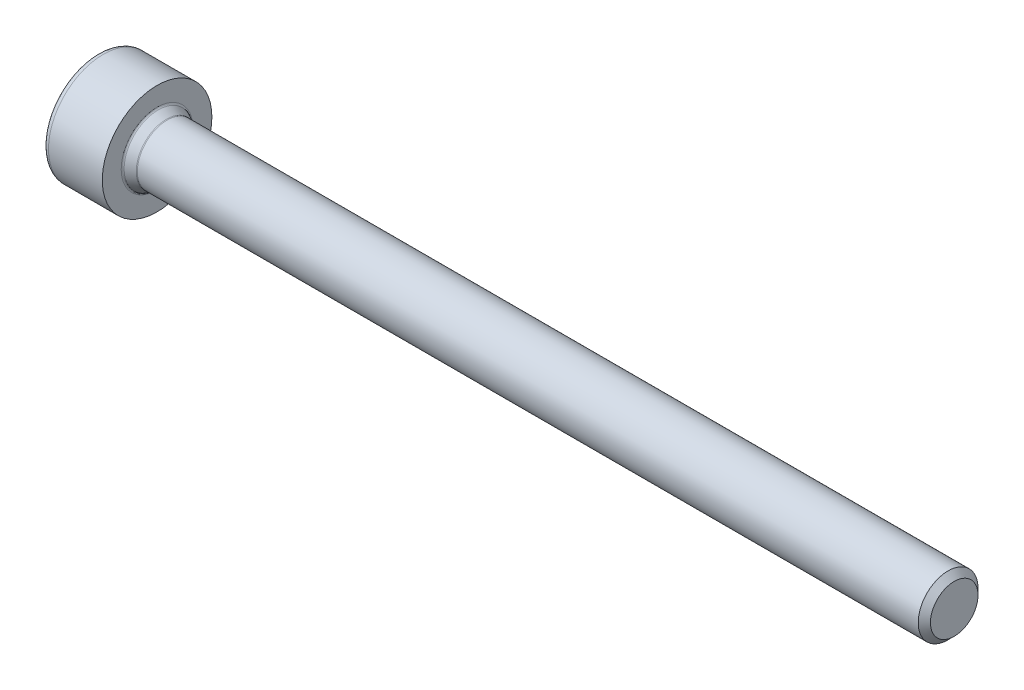
ISO-10303-21;
HEADER;
FILE_DESCRIPTION(('STEP AP214'),'2;1');
FILE_NAME('part.step','',(''),(''),'','','');
FILE_SCHEMA(('AUTOMOTIVE_DESIGN { 1 0 10303 214 1 1 1 1 }'));
ENDSEC;
DATA;
#1=APPLICATION_CONTEXT('core data for automotive mechanical design processes');
#2=APPLICATION_PROTOCOL_DEFINITION('international standard','automotive_design',2000,#1);
#3=PRODUCT_CONTEXT('',#1,'mechanical');
#4=PRODUCT('Part','Part','',(#3));
#5=PRODUCT_RELATED_PRODUCT_CATEGORY('part','',(#4));
#6=PRODUCT_DEFINITION_FORMATION('','',#4);
#7=PRODUCT_DEFINITION_CONTEXT('part definition',#1,'design');
#8=PRODUCT_DEFINITION('design','',#6,#7);
#9=PRODUCT_DEFINITION_SHAPE('','',#8);
#10=(LENGTH_UNIT() NAMED_UNIT(*) SI_UNIT(.MILLI.,.METRE.));
#11=(NAMED_UNIT(*) PLANE_ANGLE_UNIT() SI_UNIT($,.RADIAN.));
#12=(NAMED_UNIT(*) SI_UNIT($,.STERADIAN.) SOLID_ANGLE_UNIT());
#13=UNCERTAINTY_MEASURE_WITH_UNIT(LENGTH_MEASURE(1.E-05),#10,'distance_accuracy_value','');
#14=(GEOMETRIC_REPRESENTATION_CONTEXT(3) GLOBAL_UNCERTAINTY_ASSIGNED_CONTEXT((#13)) GLOBAL_UNIT_ASSIGNED_CONTEXT((#10,
#11,#12)) REPRESENTATION_CONTEXT('',''));
#15=CARTESIAN_POINT('',(0.,0.,0.));
#16=DIRECTION('',(0.,0.,1.));
#17=DIRECTION('',(1.,0.,0.));
#18=AXIS2_PLACEMENT_3D('',#15,#16,#17);
#19=CARTESIAN_POINT('',(-2.9075,0.,0.));
#20=DIRECTION('',(-1.,0.,0.));
#21=DIRECTION('',(0.,0.,-1.));
#22=AXIS2_PLACEMENT_3D('',#19,#20,#21);
#23=CONICAL_SURFACE('',#22,1.3425,0.7853981633973);
#24=CARTESIAN_POINT('',(-3.,0.,0.));
#25=DIRECTION('',(1.,0.,0.));
#26=DIRECTION('',(0.,0.491140907266199,0.871080139372799));
#27=AXIS2_PLACEMENT_3D('',#24,#25,#26);
#28=CIRCLE('',#27,1.435);
#29=CARTESIAN_POINT('',(-2.99999999999999,0.704787201926916,1.25));
#30=VERTEX_POINT('',#29);
#31=CARTESIAN_POINT('',(-2.99999999999984,-0.70478720192637,1.25000000000013));
#32=VERTEX_POINT('',#31);
#33=EDGE_CURVE('E159',#30,#32,#28,.T.);
#34=ORIENTED_EDGE('',*,*,#33,.F.);
#35=CARTESIAN_POINT('',(-2.99999999999969,-0.704787201926252,1.25));
#36=CARTESIAN_POINT('',(-2.97628521465341,-0.65646362036293,1.25));
#37=CARTESIAN_POINT('',(-2.95399453161448,-0.607346612474087,1.25));
#38=CARTESIAN_POINT('',(-2.91320818109187,-0.507229058889315,1.25));
#39=CARTESIAN_POINT('',(-2.89473623112673,-0.456218934072351,1.25));
#40=CARTESIAN_POINT('',(-2.86290698914588,-0.352798361186506,1.25));
#41=CARTESIAN_POINT('',(-2.84953056237021,-0.300393958639836,1.25));
#42=CARTESIAN_POINT('',(-2.82898027876658,-0.194487441720485,1.25));
#43=CARTESIAN_POINT('',(-2.82178823977539,-0.140989021874516,1.25));
#44=CARTESIAN_POINT('',(-2.81703078818954,-0.0727567227819167,1.25));
#45=CARTESIAN_POINT('',(-2.81627010168138,-0.0582126032376335,1.25));
#46=CARTESIAN_POINT('',(-2.81525458541861,-0.0291129972122368,1.25));
#47=CARTESIAN_POINT('',(-2.81499952620831,-0.0145575188872272,1.25));
#48=CARTESIAN_POINT('',(-2.81500123473012,0.0379377877025121,1.25));
#49=CARTESIAN_POINT('',(-2.81673793612621,0.075889433997383,1.25));
#50=CARTESIAN_POINT('',(-2.82358164401925,0.15149658655596,1.25));
#51=CARTESIAN_POINT('',(-2.82869102651631,0.189151865095155,1.25));
#52=CARTESIAN_POINT('',(-2.84875546782902,0.301599972661517,1.25));
#53=CARTESIAN_POINT('',(-2.86844359299294,0.375574474615403,1.25));
#54=CARTESIAN_POINT('',(-2.90770920230099,0.492061542974082,1.25));
#55=CARTESIAN_POINT('',(-2.92436216214609,0.535638893484887,1.25));
#56=CARTESIAN_POINT('',(-2.96033907941291,0.621244601118333,1.25));
#57=CARTESIAN_POINT('',(-2.97963888447641,0.663283043107509,1.25));
#58=CARTESIAN_POINT('',(-3.00000000000001,0.704787201926896,1.25));
#59=B_SPLINE_CURVE_WITH_KNOTS('',3,(#35,#36,#37,#38,#39,#40,#41,#42,#43,#44,#45,#46,#47,#48,#49,
#50,#51,#52,#53,#54,#55,#56,#57,#58),.UNSPECIFIED.,.F.,.F.,(4,2,2,2,2,2,2,2,2,2,2,4),(0.,
0.161592976396798,0.324161275577647,0.486112933084189,0.647586807011873,0.691272786931178,
0.734938937435903,0.848735605705226,0.962612527596107,1.19125625256394,1.33113310638875,
1.46980937836746),.UNSPECIFIED.);
#60=EDGE_CURVE('E41',#32,#30,#59,.T.);
#61=ORIENTED_EDGE('',*,*,#60,.F.);
#62=EDGE_LOOP('',(#34,#61));
#63=FACE_BOUND('',#62,.T.);
#64=ADVANCED_FACE('F17',(#63),#23,.F.);
#65=CARTESIAN_POINT('',(-3.,0.,-1.9425));
#66=DIRECTION('',(-1.,0.,0.));
#67=DIRECTION('',(0.,0.,-1.));
#68=AXIS2_PLACEMENT_3D('',#65,#66,#67);
#69=PLANE('',#68);
#70=CARTESIAN_POINT('',(-3.,0.,0.));
#71=DIRECTION('',(-1.,0.,0.));
#72=DIRECTION('',(0.,0.,1.));
#73=AXIS2_PLACEMENT_3D('',#70,#71,#72);
#74=CIRCLE('',#73,2.45);
#75=CARTESIAN_POINT('',(-3.,0.,2.45));
#76=VERTEX_POINT('',#75);
#77=EDGE_CURVE('E11',#76,#76,#74,.T.);
#78=ORIENTED_EDGE('',*,*,#77,.T.);
#79=EDGE_LOOP('',(#78));
#80=FACE_BOUND('',#79,.T.);
#81=DIRECTION('',(0.,-1.,1.480679727431E-11));
#82=VECTOR('',#81,1.);
#83=CARTESIAN_POINT('',(-3.,-0.7047872019261,-1.25));
#84=LINE('',#83,#82);
#85=CARTESIAN_POINT('',(-2.99999999999999,-0.704787201926908,-1.25));
#86=VERTEX_POINT('',#85);
#87=CARTESIAN_POINT('',(-3.,-0.721687836487,-1.25));
#88=VERTEX_POINT('',#87);
#89=EDGE_CURVE('E217',#86,#88,#84,.T.);
#90=ORIENTED_EDGE('',*,*,#89,.F.);
#91=CARTESIAN_POINT('',(-3.,0.,0.));
#92=DIRECTION('',(1.,0.,0.));
#93=DIRECTION('',(0.,-0.491140907266199,-0.871080139372799));
#94=AXIS2_PLACEMENT_3D('',#91,#92,#93);
#95=CIRCLE('',#94,1.435);
#96=CARTESIAN_POINT('',(-3.,0.704787201926685,-1.25000000000013));
#97=VERTEX_POINT('',#96);
#98=EDGE_CURVE('E32',#86,#97,#95,.T.);
#99=ORIENTED_EDGE('',*,*,#98,.T.);
#100=DIRECTION('',(0.,-1.,-1.495131792205E-11));
#101=VECTOR('',#100,1.);
#102=CARTESIAN_POINT('',(-3.,0.721687836487,-1.25));
#103=LINE('',#102,#101);
#104=CARTESIAN_POINT('',(-3.,0.721687836487,-1.25));
#105=VERTEX_POINT('',#104);
#106=EDGE_CURVE('E213',#105,#97,#103,.T.);
#107=ORIENTED_EDGE('',*,*,#106,.F.);
#108=DIRECTION('',(0.,-0.500000000012821,-0.866025403777036));
#109=VECTOR('',#108,1.);
#110=CARTESIAN_POINT('',(-3.,0.7301381537677,-1.23536362113));
#111=LINE('',#110,#109);
#112=CARTESIAN_POINT('',(-3.,0.730138153767155,-1.23536362113082));
#113=VERTEX_POINT('',#112);
#114=EDGE_CURVE('E229',#113,#105,#111,.T.);
#115=ORIENTED_EDGE('',*,*,#114,.F.);
#116=CARTESIAN_POINT('',(-3.,0.,0.));
#117=DIRECTION('',(1.,0.,0.));
#118=DIRECTION('',(0.,0.508807075795911,-0.860880572216619));
#119=AXIS2_PLACEMENT_3D('',#116,#117,#118);
#120=CIRCLE('',#119,1.435);
#121=CARTESIAN_POINT('',(-3.,1.434925355694,-0.0146363788693456));
#122=VERTEX_POINT('',#121);
#123=EDGE_CURVE('E222',#113,#122,#120,.T.);
#124=ORIENTED_EDGE('',*,*,#123,.T.);
#125=DIRECTION('',(0.,-0.499999999986976,-0.866025403791958));
#126=VECTOR('',#125,1.);
#127=CARTESIAN_POINT('',(-3.,1.443375672974,0.));
#128=LINE('',#127,#126);
#129=CARTESIAN_POINT('',(-3.,1.443375672974,0.));
#130=VERTEX_POINT('',#129);
#131=EDGE_CURVE('E223',#130,#122,#128,.T.);
#132=ORIENTED_EDGE('',*,*,#131,.F.);
#133=DIRECTION('',(0.,0.499999999987212,-0.866025403791822));
#134=VECTOR('',#133,1.);
#135=CARTESIAN_POINT('',(-3.,1.434925355694,0.01463637886995));
#136=LINE('',#135,#134);
#137=CARTESIAN_POINT('',(-3.,1.434925355694,0.0146363788694952));
#138=VERTEX_POINT('',#137);
#139=EDGE_CURVE('E135',#138,#130,#136,.T.);
#140=ORIENTED_EDGE('',*,*,#139,.F.);
#141=CARTESIAN_POINT('',(-3.,0.,0.));
#142=DIRECTION('',(1.,0.,0.));
#143=DIRECTION('',(0.,0.999947983062032,0.0101995671561803));
#144=AXIS2_PLACEMENT_3D('',#141,#142,#143);
#145=CIRCLE('',#144,1.435);
#146=CARTESIAN_POINT('',(-3.,0.730138153767218,1.23536362113078));
#147=VERTEX_POINT('',#146);
#148=EDGE_CURVE('E228',#138,#147,#145,.T.);
#149=ORIENTED_EDGE('',*,*,#148,.T.);
#150=DIRECTION('',(0.,0.500000000012971,-0.86602540377695));
#151=VECTOR('',#150,1.);
#152=CARTESIAN_POINT('',(-3.,0.721687836487,1.25));
#153=LINE('',#152,#151);
#154=CARTESIAN_POINT('',(-3.,0.721687836487,1.25));
#155=VERTEX_POINT('',#154);
#156=EDGE_CURVE('E233',#155,#147,#153,.T.);
#157=ORIENTED_EDGE('',*,*,#156,.F.);
#158=DIRECTION('',(0.,1.,-1.480679727431E-11));
#159=VECTOR('',#158,1.);
#160=CARTESIAN_POINT('',(-3.,0.7047872019261,1.25));
#161=LINE('',#160,#159);
#162=EDGE_CURVE('E141',#30,#155,#161,.T.);
#163=ORIENTED_EDGE('',*,*,#162,.F.);
#164=ORIENTED_EDGE('',*,*,#33,.T.);
#165=DIRECTION('',(0.,1.,1.497759440346E-11));
#166=VECTOR('',#165,1.);
#167=CARTESIAN_POINT('',(-3.,-0.721687836487,1.25));
#168=LINE('',#167,#166);
#169=CARTESIAN_POINT('',(-3.,-0.721687836487,1.25));
#170=VERTEX_POINT('',#169);
#171=EDGE_CURVE('E156',#170,#32,#168,.T.);
#172=ORIENTED_EDGE('',*,*,#171,.F.);
#173=DIRECTION('',(0.,0.500000000012778,0.866025403777062));
#174=VECTOR('',#173,1.);
#175=CARTESIAN_POINT('',(-3.,-0.7301381537677,1.23536362113));
#176=LINE('',#175,#174);
#177=CARTESIAN_POINT('',(-3.,-0.730138153767155,1.23536362113082));
#178=VERTEX_POINT('',#177);
#179=EDGE_CURVE('E146',#178,#170,#176,.T.);
#180=ORIENTED_EDGE('',*,*,#179,.F.);
#181=CARTESIAN_POINT('',(-3.,0.,0.));
#182=DIRECTION('',(1.,0.,0.));
#183=DIRECTION('',(0.,-0.508807075795911,0.860880572216619));
#184=AXIS2_PLACEMENT_3D('',#181,#182,#183);
#185=CIRCLE('',#184,1.435);
#186=CARTESIAN_POINT('',(-3.,-1.434925355694,0.0146363788693456));
#187=VERTEX_POINT('',#186);
#188=EDGE_CURVE('E208',#178,#187,#185,.T.);
#189=ORIENTED_EDGE('',*,*,#188,.T.);
#190=DIRECTION('',(0.,0.499999999986976,0.866025403791958));
#191=VECTOR('',#190,1.);
#192=CARTESIAN_POINT('',(-3.,-1.443375672974,0.));
#193=LINE('',#192,#191);
#194=CARTESIAN_POINT('',(-3.,-1.443375672974,0.));
#195=VERTEX_POINT('',#194);
#196=EDGE_CURVE('E54',#195,#187,#193,.T.);
#197=ORIENTED_EDGE('',*,*,#196,.F.);
#198=DIRECTION('',(0.,-0.499999999987212,0.866025403791822));
#199=VECTOR('',#198,1.);
#200=CARTESIAN_POINT('',(-3.,-1.434925355694,-0.01463637886995));
#201=LINE('',#200,#199);
#202=CARTESIAN_POINT('',(-3.,-1.434925355694,-0.0146363788694952));
#203=VERTEX_POINT('',#202);
#204=EDGE_CURVE('E210',#203,#195,#201,.T.);
#205=ORIENTED_EDGE('',*,*,#204,.F.);
#206=CARTESIAN_POINT('',(-3.,0.,0.));
#207=DIRECTION('',(1.,0.,0.));
#208=DIRECTION('',(0.,-0.999947983062032,-0.0101995671561803));
#209=AXIS2_PLACEMENT_3D('',#206,#207,#208);
#210=CIRCLE('',#209,1.435);
#211=CARTESIAN_POINT('',(-3.,-0.730138153767219,-1.23536362113078));
#212=VERTEX_POINT('',#211);
#213=EDGE_CURVE('E205',#203,#212,#210,.T.);
#214=ORIENTED_EDGE('',*,*,#213,.T.);
#215=DIRECTION('',(0.,-0.500000000013014,0.866025403776925));
#216=VECTOR('',#215,1.);
#217=CARTESIAN_POINT('',(-3.,-0.721687836487,-1.25));
#218=LINE('',#217,#216);
#219=EDGE_CURVE('E201',#88,#212,#218,.T.);
#220=ORIENTED_EDGE('',*,*,#219,.F.);
#221=EDGE_LOOP('',(#90,#99,#107,#115,#124,#132,#140,#149,#157,#163,#164,#172,#180,#189,#197,
#205,#214,#220));
#222=FACE_BOUND('',#221,.T.);
#223=ADVANCED_FACE('F158',(#80,#222),#69,.T.);
#224=CARTESIAN_POINT('',(-2.7,0.,0.));
#225=DIRECTION('',(-1.,0.,0.));
#226=DIRECTION('',(0.,0.,1.));
#227=AXIS2_PLACEMENT_3D('',#224,#225,#226);
#228=TOROIDAL_SURFACE('',#227,2.45,0.3);
#229=CARTESIAN_POINT('',(-2.7,0.,0.));
#230=DIRECTION('',(-1.,0.,0.));
#231=DIRECTION('',(0.,0.,-1.));
#232=AXIS2_PLACEMENT_3D('',#229,#230,#231);
#233=CIRCLE('',#232,2.75);
#234=CARTESIAN_POINT('',(-2.7,0.,-2.75));
#235=VERTEX_POINT('',#234);
#236=EDGE_CURVE('E209',#235,#235,#233,.T.);
#237=ORIENTED_EDGE('',*,*,#236,.T.);
#238=EDGE_LOOP('',(#237));
#239=FACE_BOUND('',#238,.T.);
#240=ORIENTED_EDGE('',*,*,#77,.F.);
#241=EDGE_LOOP('',(#240));
#242=FACE_BOUND('',#241,.T.);
#243=ADVANCED_FACE('F337',(#239,#242),#228,.T.);
#244=CARTESIAN_POINT('',(-1.35,0.,0.));
#245=DIRECTION('',(1.,0.,0.));
#246=DIRECTION('',(0.,0.,-1.));
#247=AXIS2_PLACEMENT_3D('',#244,#245,#246);
#248=CYLINDRICAL_SURFACE('',#247,2.75);
#249=CARTESIAN_POINT('',(0.,0.,0.));
#250=DIRECTION('',(1.,0.,0.));
#251=DIRECTION('',(0.,0.,-1.));
#252=AXIS2_PLACEMENT_3D('',#249,#250,#251);
#253=CIRCLE('',#252,2.75);
#254=CARTESIAN_POINT('',(0.,0.,-2.75));
#255=VERTEX_POINT('',#254);
#256=EDGE_CURVE('E623',#255,#255,#253,.T.);
#257=ORIENTED_EDGE('',*,*,#256,.F.);
#258=EDGE_LOOP('',(#257));
#259=FACE_BOUND('',#258,.T.);
#260=ORIENTED_EDGE('',*,*,#236,.F.);
#261=EDGE_LOOP('',(#260));
#262=FACE_BOUND('',#261,.T.);
#263=ADVANCED_FACE('F344',(#259,#262),#248,.T.);
#264=CARTESIAN_POINT('',(0.,0.,-2.275));
#265=DIRECTION('',(1.,0.,0.));
#266=DIRECTION('',(0.,0.,1.));
#267=AXIS2_PLACEMENT_3D('',#264,#265,#266);
#268=PLANE('',#267);
#269=ORIENTED_EDGE('',*,*,#256,.T.);
#270=EDGE_LOOP('',(#269));
#271=FACE_BOUND('',#270,.T.);
#272=CARTESIAN_POINT('',(0.,0.,0.));
#273=DIRECTION('',(-1.,0.,0.));
#274=DIRECTION('',(0.,0.,1.));
#275=AXIS2_PLACEMENT_3D('',#272,#273,#274);
#276=CIRCLE('',#275,1.8);
#277=CARTESIAN_POINT('',(0.,0.,1.8));
#278=VERTEX_POINT('',#277);
#279=EDGE_CURVE('E620',#278,#278,#276,.T.);
#280=ORIENTED_EDGE('',*,*,#279,.T.);
#281=EDGE_LOOP('',(#280));
#282=FACE_BOUND('',#281,.T.);
#283=ADVANCED_FACE('F348',(#271,#282),#268,.T.);
#284=CARTESIAN_POINT('',(0.1,0.,0.));
#285=DIRECTION('',(-1.,0.,0.));
#286=DIRECTION('',(0.,0.,1.));
#287=AXIS2_PLACEMENT_3D('',#284,#285,#286);
#288=TOROIDAL_SURFACE('',#287,1.8,0.1);
#289=CARTESIAN_POINT('',(0.05615763679786,0.,0.));
#290=DIRECTION('',(-1.,0.,0.));
#291=DIRECTION('',(0.,0.,-1.));
#292=AXIS2_PLACEMENT_3D('',#289,#290,#291);
#293=CIRCLE('',#292,1.710123155436);
#294=CARTESIAN_POINT('',(0.05615763679786,0.,-1.710123155436));
#295=VERTEX_POINT('',#294);
#296=EDGE_CURVE('E615',#295,#295,#293,.T.);
#297=ORIENTED_EDGE('',*,*,#296,.T.);
#298=EDGE_LOOP('',(#297));
#299=FACE_BOUND('',#298,.T.);
#300=ORIENTED_EDGE('',*,*,#279,.F.);
#301=EDGE_LOOP('',(#300));
#302=FACE_BOUND('',#301,.T.);
#303=ADVANCED_FACE('F352',(#299,#302),#288,.F.);
#304=CARTESIAN_POINT('',(0.2611576367979,0.,0.));
#305=DIRECTION('',(-1.,0.,0.));
#306=DIRECTION('',(0.,0.,-1.));
#307=AXIS2_PLACEMENT_3D('',#304,#305,#306);
#308=CONICAL_SURFACE('',#307,1.610123155436,0.453844001521399);
#309=CARTESIAN_POINT('',(0.4661576367979,0.,0.));
#310=DIRECTION('',(1.,0.,0.));
#311=DIRECTION('',(0.,0.,-1.));
#312=AXIS2_PLACEMENT_3D('',#309,#310,#311);
#313=CIRCLE('',#312,1.510123155436);
#314=CARTESIAN_POINT('',(0.4661576367979,0.,-1.510123155436));
#315=VERTEX_POINT('',#314);
#316=EDGE_CURVE('E385',#315,#315,#313,.T.);
#317=ORIENTED_EDGE('',*,*,#316,.F.);
#318=EDGE_LOOP('',(#317));
#319=FACE_BOUND('',#318,.T.);
#320=ORIENTED_EDGE('',*,*,#296,.F.);
#321=EDGE_LOOP('',(#320));
#322=FACE_BOUND('',#321,.T.);
#323=ADVANCED_FACE('F356',(#319,#322),#308,.T.);
#324=CARTESIAN_POINT('',(0.51,0.,0.));
#325=DIRECTION('',(-1.,0.,0.));
#326=DIRECTION('',(0.,0.,1.));
#327=AXIS2_PLACEMENT_3D('',#324,#325,#326);
#328=TOROIDAL_SURFACE('',#327,1.6,0.1);
#329=CARTESIAN_POINT('',(0.51,0.,0.));
#330=DIRECTION('',(-1.,0.,0.));
#331=DIRECTION('',(0.,0.,-1.));
#332=AXIS2_PLACEMENT_3D('',#329,#330,#331);
#333=CIRCLE('',#332,1.5);
#334=CARTESIAN_POINT('',(0.51,0.,-1.5));
#335=VERTEX_POINT('',#334);
#336=EDGE_CURVE('E612',#335,#335,#333,.T.);
#337=ORIENTED_EDGE('',*,*,#336,.T.);
#338=EDGE_LOOP('',(#337));
#339=FACE_BOUND('',#338,.T.);
#340=ORIENTED_EDGE('',*,*,#316,.T.);
#341=EDGE_LOOP('',(#340));
#342=FACE_BOUND('',#341,.T.);
#343=ADVANCED_FACE('F360',(#339,#342),#328,.F.);
#344=CARTESIAN_POINT('',(20.10175,0.,0.));
#345=DIRECTION('',(1.,0.,0.));
#346=DIRECTION('',(0.,0.,-1.));
#347=AXIS2_PLACEMENT_3D('',#344,#345,#346);
#348=CYLINDRICAL_SURFACE('',#347,1.5);
#349=CARTESIAN_POINT('',(39.6935,0.,0.));
#350=DIRECTION('',(1.,0.,0.));
#351=DIRECTION('',(0.,0.,-1.));
#352=AXIS2_PLACEMENT_3D('',#349,#350,#351);
#353=CIRCLE('',#352,1.5);
#354=CARTESIAN_POINT('',(39.6935,0.,-1.5));
#355=VERTEX_POINT('',#354);
#356=EDGE_CURVE('E382',#355,#355,#353,.T.);
#357=ORIENTED_EDGE('',*,*,#356,.F.);
#358=EDGE_LOOP('',(#357));
#359=FACE_BOUND('',#358,.T.);
#360=ORIENTED_EDGE('',*,*,#336,.F.);
#361=EDGE_LOOP('',(#360));
#362=FACE_BOUND('',#361,.T.);
#363=ADVANCED_FACE('F364',(#359,#362),#348,.T.);
#364=CARTESIAN_POINT('',(39.84675,0.,0.));
#365=DIRECTION('',(-1.,0.,0.));
#366=DIRECTION('',(0.,0.,-1.));
#367=AXIS2_PLACEMENT_3D('',#364,#365,#366);
#368=CONICAL_SURFACE('',#367,1.34675,0.7853981633973);
#369=CARTESIAN_POINT('',(40.,0.,0.));
#370=DIRECTION('',(1.,0.,0.));
#371=DIRECTION('',(0.,0.,1.));
#372=AXIS2_PLACEMENT_3D('',#369,#370,#371);
#373=CIRCLE('',#372,1.1935);
#374=CARTESIAN_POINT('',(40.,0.,1.1935));
#375=VERTEX_POINT('',#374);
#376=EDGE_CURVE('E381',#375,#375,#373,.T.);
#377=ORIENTED_EDGE('',*,*,#376,.F.);
#378=EDGE_LOOP('',(#377));
#379=FACE_BOUND('',#378,.T.);
#380=ORIENTED_EDGE('',*,*,#356,.T.);
#381=EDGE_LOOP('',(#380));
#382=FACE_BOUND('',#381,.T.);
#383=ADVANCED_FACE('F368',(#379,#382),#368,.T.);
#384=CARTESIAN_POINT('',(40.,0.,-0.59675));
#385=DIRECTION('',(1.,0.,0.));
#386=DIRECTION('',(0.,0.,1.));
#387=AXIS2_PLACEMENT_3D('',#384,#385,#386);
#388=PLANE('',#387);
#389=ORIENTED_EDGE('',*,*,#376,.T.);
#390=EDGE_LOOP('',(#389));
#391=FACE_BOUND('',#390,.T.);
#392=ADVANCED_FACE('F371',(#391),#388,.T.);
#393=CARTESIAN_POINT('',(-1.15,-1.443375672974,0.));
#394=DIRECTION('',(0.,-0.866025403784429,-0.500000000000017));
#395=DIRECTION('',(0.,-0.500000000000017,0.866025403784429));
#396=AXIS2_PLACEMENT_3D('',#393,#394,#395);
#397=PLANE('',#396);
#398=DIRECTION('',(1.,0.,0.));
#399=VECTOR('',#398,1.);
#400=CARTESIAN_POINT('',(-3.,-1.443375672974,0.));
#401=LINE('',#400,#399);
#402=CARTESIAN_POINT('',(-1.15,-1.443375672974,0.));
#403=VERTEX_POINT('',#402);
#404=EDGE_CURVE('E203',#195,#403,#401,.T.);
#405=ORIENTED_EDGE('',*,*,#404,.T.);
#406=DIRECTION('',(0.,-0.500000000000017,0.866025403784429));
#407=VECTOR('',#406,1.);
#408=CARTESIAN_POINT('',(-1.15,-1.082531754731,-0.625));
#409=LINE('',#408,#407);
#410=CARTESIAN_POINT('',(-1.15,-1.082531754731,-0.625));
#411=VERTEX_POINT('',#410);
#412=EDGE_CURVE('E154',#411,#403,#409,.T.);
#413=ORIENTED_EDGE('',*,*,#412,.F.);
#414=DIRECTION('',(0.,-0.500000000000017,0.866025403784429));
#415=VECTOR('',#414,1.);
#416=CARTESIAN_POINT('',(-1.15,-0.721687836487,-1.25));
#417=LINE('',#416,#415);
#418=CARTESIAN_POINT('',(-1.15,-0.721687836487,-1.25));
#419=VERTEX_POINT('',#418);
#420=EDGE_CURVE('E183',#419,#411,#417,.T.);
#421=ORIENTED_EDGE('',*,*,#420,.F.);
#422=DIRECTION('',(1.,0.,0.));
#423=VECTOR('',#422,1.);
#424=CARTESIAN_POINT('',(-3.,-0.721687836487,-1.25));
#425=LINE('',#424,#423);
#426=EDGE_CURVE('E212',#88,#419,#425,.T.);
#427=ORIENTED_EDGE('',*,*,#426,.F.);
#428=ORIENTED_EDGE('',*,*,#219,.T.);
#429=CARTESIAN_POINT('',(-3.,-0.730138153766961,-1.23536362113092));
#430=CARTESIAN_POINT('',(-2.97628521465368,-0.754299944548643,-1.1935141718952));
#431=CARTESIAN_POINT('',(-2.95399453161471,-0.778858448493087,-1.15097759530554));
#432=CARTESIAN_POINT('',(-2.91320818109203,-0.82891722528552,-1.0642732505363));
#433=CARTESIAN_POINT('',(-2.89473623112685,-0.854422287694026,-1.02009718659456));
#434=CARTESIAN_POINT('',(-2.86290698914593,-0.906132574136999,-0.930532343201392));
#435=CARTESIAN_POINT('',(-2.84953056237022,-0.932334775410361,-0.885148799325785));
#436=CARTESIAN_POINT('',(-2.82898027876655,-0.985288033870092,-0.793431065247209));
#437=CARTESIAN_POINT('',(-2.82178823977534,-1.0120372437931,-0.747100074598227));
#438=CARTESIAN_POINT('',(-2.81703078818948,-1.04615339333947,-0.68800917022531));
#439=CARTESIAN_POINT('',(-2.81627010168131,-1.05342545311164,-0.675413593224224));
#440=CARTESIAN_POINT('',(-2.81525458541854,-1.06797525612441,-0.650212595165992));
#441=CARTESIAN_POINT('',(-2.81499952620824,-1.07525299528695,-0.63760718117224));
#442=CARTESIAN_POINT('',(-2.81500123473006,-1.10150064858186,-0.59214491208601));
#443=CARTESIAN_POINT('',(-2.81673793612616,-1.1204764717293,-0.559277822279208));
#444=CARTESIAN_POINT('',(-2.82358164401921,-1.15828004800859,-0.49380010745567));
#445=CARTESIAN_POINT('',(-2.82869102651628,-1.17710768727819,-0.461189679654146));
#446=CARTESIAN_POINT('',(-2.84875546782901,-1.23333174106138,-0.363806761894187));
#447=CARTESIAN_POINT('',(-2.86844359299295,-1.27031899203832,-0.299742963969819));
#448=CARTESIAN_POINT('',(-2.90770920230102,-1.32856252621765,-0.198862203558859));
#449=CARTESIAN_POINT('',(-2.92436216214611,-1.35035120147303,-0.161123110986915));
#450=CARTESIAN_POINT('',(-2.96033907941291,-1.39315405528972,-0.0869863934674693));
#451=CARTESIAN_POINT('',(-2.9796388844764,-1.41417327628429,-0.0505800347693544));
#452=CARTESIAN_POINT('',(-2.99999999999998,-1.43492535569397,-0.0146363788690904));
#453=B_SPLINE_CURVE_WITH_KNOTS('',3,(#429,#430,#431,#432,#433,#434,#435,#436,#437,#438,#439,
#440,#441,#442,#443,#444,#445,#446,#447,#448,#449,#450,#451,#452),.UNSPECIFIED.,.F.,.F.,(4,2,2,
2,2,2,2,2,2,2,2,4),(0.,0.161592976396964,0.324161275577982,0.486112933084696,0.64758680701255,
0.691272786932063,0.734938937436996,0.84873560570633,0.962612527597222,1.19125625256508,
1.33113310638978,1.46980937836838),.UNSPECIFIED.);
#454=EDGE_CURVE('E204',#212,#203,#453,.T.);
#455=ORIENTED_EDGE('',*,*,#454,.T.);
#456=ORIENTED_EDGE('',*,*,#204,.T.);
#457=EDGE_LOOP('',(#405,#413,#421,#427,#428,#455,#456));
#458=FACE_BOUND('',#457,.T.);
#459=ADVANCED_FACE('F253',(#458),#397,.F.);
#460=CARTESIAN_POINT('',(-2.9075,0.,0.));
#461=DIRECTION('',(-1.,0.,0.));
#462=DIRECTION('',(0.,0.,-1.));
#463=AXIS2_PLACEMENT_3D('',#460,#461,#462);
#464=CONICAL_SURFACE('',#463,1.3425,0.7853981633973);
#465=ORIENTED_EDGE('',*,*,#213,.F.);
#466=ORIENTED_EDGE('',*,*,#454,.F.);
#467=EDGE_LOOP('',(#465,#466));
#468=FACE_BOUND('',#467,.T.);
#469=ADVANCED_FACE('F256',(#468),#464,.F.);
#470=CARTESIAN_POINT('',(-1.15,-0.721687836487,-1.25));
#471=DIRECTION('',(0.,0.,-1.));
#472=DIRECTION('',(0.,-1.,0.));
#473=AXIS2_PLACEMENT_3D('',#470,#471,#472);
#474=PLANE('',#473);
#475=ORIENTED_EDGE('',*,*,#426,.T.);
#476=DIRECTION('',(0.,-1.,0.));
#477=VECTOR('',#476,1.);
#478=CARTESIAN_POINT('',(-1.15,0.,-1.25));
#479=LINE('',#478,#477);
#480=CARTESIAN_POINT('',(-1.15,0.,-1.25));
#481=VERTEX_POINT('',#480);
#482=EDGE_CURVE('E187',#481,#419,#479,.T.);
#483=ORIENTED_EDGE('',*,*,#482,.F.);
#484=DIRECTION('',(0.,-1.,0.));
#485=VECTOR('',#484,1.);
#486=CARTESIAN_POINT('',(-1.15,0.721687836487,-1.25));
#487=LINE('',#486,#485);
#488=CARTESIAN_POINT('',(-1.15,0.721687836487,-1.25));
#489=VERTEX_POINT('',#488);
#490=EDGE_CURVE('E199',#489,#481,#487,.T.);
#491=ORIENTED_EDGE('',*,*,#490,.F.);
#492=DIRECTION('',(1.,0.,0.));
#493=VECTOR('',#492,1.);
#494=CARTESIAN_POINT('',(-3.,0.721687836487,-1.25));
#495=LINE('',#494,#493);
#496=EDGE_CURVE('E220',#105,#489,#495,.T.);
#497=ORIENTED_EDGE('',*,*,#496,.F.);
#498=ORIENTED_EDGE('',*,*,#106,.T.);
#499=CARTESIAN_POINT('',(-2.99999999999969,0.704787201926252,-1.25));
#500=CARTESIAN_POINT('',(-2.97628521465341,0.65646362036293,-1.25));
#501=CARTESIAN_POINT('',(-2.95399453161448,0.607346612474086,-1.25));
#502=CARTESIAN_POINT('',(-2.91320818109187,0.507229058889314,-1.25));
#503=CARTESIAN_POINT('',(-2.89473623112673,0.45621893407235,-1.25));
#504=CARTESIAN_POINT('',(-2.86290698914588,0.352798361186506,-1.25));
#505=CARTESIAN_POINT('',(-2.8495305623702,0.300393958639835,-1.25));
#506=CARTESIAN_POINT('',(-2.82898027876658,0.194487441720485,-1.25));
#507=CARTESIAN_POINT('',(-2.82178823977539,0.140989021874516,-1.25));
#508=CARTESIAN_POINT('',(-2.81703078818954,0.0727567227819167,-1.25));
#509=CARTESIAN_POINT('',(-2.81627010168138,0.0582126032376335,-1.25));
#510=CARTESIAN_POINT('',(-2.81525458541861,0.0291129972122368,-1.25));
#511=CARTESIAN_POINT('',(-2.81499952620831,0.0145575188872272,-1.25));
#512=CARTESIAN_POINT('',(-2.81500123473012,-0.0379377877025123,-1.25));
#513=CARTESIAN_POINT('',(-2.81673793612621,-0.0758894339973834,-1.25));
#514=CARTESIAN_POINT('',(-2.82358164401925,-0.15149658655596,-1.25));
#515=CARTESIAN_POINT('',(-2.82869102651631,-0.189151865095156,-1.25));
#516=CARTESIAN_POINT('',(-2.84875546782902,-0.301599972661518,-1.25));
#517=CARTESIAN_POINT('',(-2.86844359299294,-0.375574474615403,-1.25));
#518=CARTESIAN_POINT('',(-2.90770920230095,-0.492061542973967,-1.25));
#519=CARTESIAN_POINT('',(-2.924362162146,-0.535638893484661,-1.25));
#520=CARTESIAN_POINT('',(-2.96033907941272,-0.621244601117893,-1.25));
#521=CARTESIAN_POINT('',(-2.97963888447616,-0.663283043106966,-1.25));
#522=CARTESIAN_POINT('',(-2.99999999999969,-0.704787201926252,-1.25));
#523=B_SPLINE_CURVE_WITH_KNOTS('',3,(#499,#500,#501,#502,#503,#504,#505,#506,#507,#508,#509,
#510,#511,#512,#513,#514,#515,#516,#517,#518,#519,#520,#521,#522),.UNSPECIFIED.,.F.,.F.,(4,2,2,
2,2,2,2,2,2,2,2,4),(0.,0.161592976396799,0.324161275577648,0.48611293308419,0.647586807011873,
0.691272786931178,0.734938937435903,0.848735605705227,0.962612527596108,1.19125625256394,
1.33113310638839,1.46980937836674),.UNSPECIFIED.);
#524=EDGE_CURVE('E216',#97,#86,#523,.T.);
#525=ORIENTED_EDGE('',*,*,#524,.T.);
#526=ORIENTED_EDGE('',*,*,#89,.T.);
#527=EDGE_LOOP('',(#475,#483,#491,#497,#498,#525,#526));
#528=FACE_BOUND('',#527,.T.);
#529=ADVANCED_FACE('F259',(#528),#474,.F.);
#530=CARTESIAN_POINT('',(-2.9075,0.,0.));
#531=DIRECTION('',(-1.,0.,0.));
#532=DIRECTION('',(0.,0.,-1.));
#533=AXIS2_PLACEMENT_3D('',#530,#531,#532);
#534=CONICAL_SURFACE('',#533,1.3425,0.7853981633973);
#535=ORIENTED_EDGE('',*,*,#98,.F.);
#536=ORIENTED_EDGE('',*,*,#524,.F.);
#537=EDGE_LOOP('',(#535,#536));
#538=FACE_BOUND('',#537,.T.);
#539=ADVANCED_FACE('F263',(#538),#534,.F.);
#540=CARTESIAN_POINT('',(-1.15,0.721687836487,-1.25));
#541=DIRECTION('',(0.,0.866025403784429,-0.500000000000017));
#542=DIRECTION('',(0.,-0.500000000000017,-0.866025403784429));
#543=AXIS2_PLACEMENT_3D('',#540,#541,#542);
#544=PLANE('',#543);
#545=ORIENTED_EDGE('',*,*,#496,.T.);
#546=DIRECTION('',(0.,-0.500000000000017,-0.866025403784429));
#547=VECTOR('',#546,1.);
#548=CARTESIAN_POINT('',(-1.15,1.082531754731,-0.625));
#549=LINE('',#548,#547);
#550=CARTESIAN_POINT('',(-1.15,1.082531754731,-0.625));
#551=VERTEX_POINT('',#550);
#552=EDGE_CURVE('E180',#551,#489,#549,.T.);
#553=ORIENTED_EDGE('',*,*,#552,.F.);
#554=DIRECTION('',(0.,-0.500000000000017,-0.866025403784429));
#555=VECTOR('',#554,1.);
#556=CARTESIAN_POINT('',(-1.15,1.443375672974,0.));
#557=LINE('',#556,#555);
#558=CARTESIAN_POINT('',(-1.15,1.443375672974,0.));
#559=VERTEX_POINT('',#558);
#560=EDGE_CURVE('E194',#559,#551,#557,.T.);
#561=ORIENTED_EDGE('',*,*,#560,.F.);
#562=DIRECTION('',(1.,0.,0.));
#563=VECTOR('',#562,1.);
#564=CARTESIAN_POINT('',(-3.,1.443375672974,0.));
#565=LINE('',#564,#563);
#566=EDGE_CURVE('E232',#130,#559,#565,.T.);
#567=ORIENTED_EDGE('',*,*,#566,.F.);
#568=ORIENTED_EDGE('',*,*,#131,.T.);
#569=CARTESIAN_POINT('',(-2.99999999999973,1.43492535569371,-0.0146363788696426));
#570=CARTESIAN_POINT('',(-2.97628521465344,1.41076356491205,-0.056485828105333));
#571=CARTESIAN_POINT('',(-2.95399453161451,1.38620506096762,-0.0990224046949571));
#572=CARTESIAN_POINT('',(-2.91320818109189,1.33614628417523,-0.185726749464129));
#573=CARTESIAN_POINT('',(-2.89473623112674,1.31064122176674,-0.229902813405841));
#574=CARTESIAN_POINT('',(-2.86290698914588,1.25893093532381,-0.319467656798933));
#575=CARTESIAN_POINT('',(-2.8495305623702,1.23272873405047,-0.364851200674501));
#576=CARTESIAN_POINT('',(-2.82898027876657,1.17977547559079,-0.456568934752997));
#577=CARTESIAN_POINT('',(-2.82178823977538,1.1530262656678,-0.502899925401938));
#578=CARTESIAN_POINT('',(-2.81703078818953,1.11891011612151,-0.56199082977472));
#579=CARTESIAN_POINT('',(-2.81627010168137,1.11163805634939,-0.574586406775714));
#580=CARTESIAN_POINT('',(-2.8152545854186,1.09708825333673,-0.59978740483376));
#581=CARTESIAN_POINT('',(-2.8149995262083,1.08981051417424,-0.61239281882742));
#582=CARTESIAN_POINT('',(-2.8150012347301,1.0635628608794,-0.657855087913548));
#583=CARTESIAN_POINT('',(-2.81673793612618,1.04458703773196,-0.690722177720343));
#584=CARTESIAN_POINT('',(-2.82358164401921,1.00678346145268,-0.756199892543866));
#585=CARTESIAN_POINT('',(-2.82869102651626,0.987955822183082,-0.788810320345383));
#586=CARTESIAN_POINT('',(-2.84875546782894,0.931731768399907,-0.886193238105324));
#587=CARTESIAN_POINT('',(-2.86844359299284,0.894744517422967,-0.950257036029682));
#588=CARTESIAN_POINT('',(-2.90770920230083,0.836500983243677,-1.05113779644058));
#589=CARTESIAN_POINT('',(-2.92436216214588,0.814712307988321,-1.08887688901248));
#590=CARTESIAN_POINT('',(-2.9603390794126,0.771909454171686,-1.16301360653183));
#591=CARTESIAN_POINT('',(-2.97963888447605,0.750890233177141,-1.1994199652299));
#592=CARTESIAN_POINT('',(-2.99999999999958,0.730138153767489,-1.23536362113012));
#593=B_SPLINE_CURVE_WITH_KNOTS('',3,(#569,#570,#571,#572,#573,#574,#575,#576,#577,#578,#579,
#580,#581,#582,#583,#584,#585,#586,#587,#588,#589,#590,#591,#592),.UNSPECIFIED.,.F.,.F.,(4,2,2,
2,2,2,2,2,2,2,2,4),(0.,0.161592976396822,0.324161275577695,0.486112933084261,0.647586807011968,
0.691272786931159,0.734938937435771,0.848735605705076,0.962612527595939,1.19125625256373,
1.33113310638823,1.46980937836663),.UNSPECIFIED.);
#594=EDGE_CURVE('E225',#122,#113,#593,.T.);
#595=ORIENTED_EDGE('',*,*,#594,.T.);
#596=ORIENTED_EDGE('',*,*,#114,.T.);
#597=EDGE_LOOP('',(#545,#553,#561,#567,#568,#595,#596));
#598=FACE_BOUND('',#597,.T.);
#599=ADVANCED_FACE('F268',(#598),#544,.F.);
#600=CARTESIAN_POINT('',(-2.9075,0.,0.));
#601=DIRECTION('',(-1.,0.,0.));
#602=DIRECTION('',(0.,0.,-1.));
#603=AXIS2_PLACEMENT_3D('',#600,#601,#602);
#604=CONICAL_SURFACE('',#603,1.3425,0.7853981633973);
#605=ORIENTED_EDGE('',*,*,#594,.F.);
#606=ORIENTED_EDGE('',*,*,#123,.F.);
#607=EDGE_LOOP('',(#605,#606));
#608=FACE_BOUND('',#607,.T.);
#609=ADVANCED_FACE('F273',(#608),#604,.F.);
#610=CARTESIAN_POINT('',(-1.15,1.443375672974,0.));
#611=DIRECTION('',(0.,0.866025403784429,0.500000000000017));
#612=DIRECTION('',(0.,0.500000000000017,-0.866025403784429));
#613=AXIS2_PLACEMENT_3D('',#610,#611,#612);
#614=PLANE('',#613);
#615=ORIENTED_EDGE('',*,*,#566,.T.);
#616=DIRECTION('',(0.,0.500000000000017,-0.866025403784429));
#617=VECTOR('',#616,1.);
#618=CARTESIAN_POINT('',(-1.15,1.082531754731,0.625));
#619=LINE('',#618,#617);
#620=CARTESIAN_POINT('',(-1.15,1.082531754731,0.625));
#621=VERTEX_POINT('',#620);
#622=EDGE_CURVE('E200',#621,#559,#619,.T.);
#623=ORIENTED_EDGE('',*,*,#622,.F.);
#624=DIRECTION('',(0.,0.500000000000017,-0.866025403784429));
#625=VECTOR('',#624,1.);
#626=CARTESIAN_POINT('',(-1.15,0.721687836487,1.25));
#627=LINE('',#626,#625);
#628=CARTESIAN_POINT('',(-1.15,0.721687836487,1.25));
#629=VERTEX_POINT('',#628);
#630=EDGE_CURVE('E190',#629,#621,#627,.T.);
#631=ORIENTED_EDGE('',*,*,#630,.F.);
#632=DIRECTION('',(1.,0.,0.));
#633=VECTOR('',#632,1.);
#634=CARTESIAN_POINT('',(-3.,0.721687836487,1.25));
#635=LINE('',#634,#633);
#636=EDGE_CURVE('E160',#155,#629,#635,.T.);
#637=ORIENTED_EDGE('',*,*,#636,.F.);
#638=ORIENTED_EDGE('',*,*,#156,.T.);
#639=CARTESIAN_POINT('',(-2.99999999999954,0.730138153767431,1.23536362113011));
#640=CARTESIAN_POINT('',(-2.97628521465327,0.754299944549087,1.19351417189443));
#641=CARTESIAN_POINT('',(-2.95399453161435,0.778858448493504,1.15097759530482));
#642=CARTESIAN_POINT('',(-2.91320818109176,0.82891722528588,1.06427325053568));
#643=CARTESIAN_POINT('',(-2.89473623112662,0.854422287694357,1.02009718659398));
#644=CARTESIAN_POINT('',(-2.86290698914579,0.906132574137268,0.930532343200926));
#645=CARTESIAN_POINT('',(-2.84953056237012,0.932334775410598,0.885148799325375));
#646=CARTESIAN_POINT('',(-2.8289802787665,0.985288033870262,0.793431065246915));
#647=CARTESIAN_POINT('',(-2.82178823977532,1.01203724379324,0.747100074597993));
#648=CARTESIAN_POINT('',(-2.81703078818947,1.04615339333955,0.688009170225165));
#649=CARTESIAN_POINT('',(-2.81627010168131,1.05342545311171,0.675413593224107));
#650=CARTESIAN_POINT('',(-2.81525458541854,1.06797525612445,0.650212595165934));
#651=CARTESIAN_POINT('',(-2.81499952620824,1.07525299528697,0.637607181172211));
#652=CARTESIAN_POINT('',(-2.81500123473006,1.10150064858186,0.59214491208601));
#653=CARTESIAN_POINT('',(-2.81673793612616,1.1204764717293,0.559277822279208));
#654=CARTESIAN_POINT('',(-2.82358164401921,1.15828004800859,0.49380010745567));
#655=CARTESIAN_POINT('',(-2.82869102651628,1.17710768727819,0.461189679654146));
#656=CARTESIAN_POINT('',(-2.84875546782901,1.23333174106138,0.363806761894187));
#657=CARTESIAN_POINT('',(-2.86844359299295,1.27031899203832,0.299742963969818));
#658=CARTESIAN_POINT('',(-2.90770920230098,1.32856252621759,0.198862203558948));
#659=CARTESIAN_POINT('',(-2.92436216214603,1.35035120147293,0.161123110987091));
#660=CARTESIAN_POINT('',(-2.96033907941273,1.39315405528952,0.086986393467812));
#661=CARTESIAN_POINT('',(-2.97963888447617,1.41417327628405,0.0505800347697776));
#662=CARTESIAN_POINT('',(-2.9999999999997,1.43492535569368,0.014636378869592));
#663=B_SPLINE_CURVE_WITH_KNOTS('',3,(#639,#640,#641,#642,#643,#644,#645,#646,#647,#648,#649,
#650,#651,#652,#653,#654,#655,#656,#657,#658,#659,#660,#661,#662),.UNSPECIFIED.,.F.,.F.,(4,2,2,
2,2,2,2,2,2,2,2,4),(0.,0.161592976396757,0.324161275577564,0.486112933084063,0.647586807011706,
0.691272786931118,0.73493893743595,0.848735605705284,0.962612527596177,1.19125625256403,
1.3311331063884,1.46980937836669),.UNSPECIFIED.);
#664=EDGE_CURVE('E131',#147,#138,#663,.T.);
#665=ORIENTED_EDGE('',*,*,#664,.T.);
#666=ORIENTED_EDGE('',*,*,#139,.T.);
#667=EDGE_LOOP('',(#615,#623,#631,#637,#638,#665,#666));
#668=FACE_BOUND('',#667,.T.);
#669=ADVANCED_FACE('F290',(#668),#614,.F.);
#670=CARTESIAN_POINT('',(-2.9075,0.,0.));
#671=DIRECTION('',(-1.,0.,0.));
#672=DIRECTION('',(0.,0.,-1.));
#673=AXIS2_PLACEMENT_3D('',#670,#671,#672);
#674=CONICAL_SURFACE('',#673,1.3425,0.7853981633973);
#675=ORIENTED_EDGE('',*,*,#664,.F.);
#676=ORIENTED_EDGE('',*,*,#148,.F.);
#677=EDGE_LOOP('',(#675,#676));
#678=FACE_BOUND('',#677,.T.);
#679=ADVANCED_FACE('F292',(#678),#674,.F.);
#680=CARTESIAN_POINT('',(-1.15,0.721687836487,1.25));
#681=DIRECTION('',(0.,0.,1.));
#682=DIRECTION('',(0.,1.,0.));
#683=AXIS2_PLACEMENT_3D('',#680,#681,#682);
#684=PLANE('',#683);
#685=ORIENTED_EDGE('',*,*,#162,.T.);
#686=ORIENTED_EDGE('',*,*,#636,.T.);
#687=DIRECTION('',(0.,1.,0.));
#688=VECTOR('',#687,1.);
#689=CARTESIAN_POINT('',(-1.15,0.,1.25));
#690=LINE('',#689,#688);
#691=CARTESIAN_POINT('',(-1.15,0.,1.25));
#692=VERTEX_POINT('',#691);
#693=EDGE_CURVE('E195',#692,#629,#690,.T.);
#694=ORIENTED_EDGE('',*,*,#693,.F.);
#695=DIRECTION('',(0.,1.,0.));
#696=VECTOR('',#695,1.);
#697=CARTESIAN_POINT('',(-1.15,-0.721687836487,1.25));
#698=LINE('',#697,#696);
#699=CARTESIAN_POINT('',(-1.15,-0.721687836487,1.25));
#700=VERTEX_POINT('',#699);
#701=EDGE_CURVE('E165',#700,#692,#698,.T.);
#702=ORIENTED_EDGE('',*,*,#701,.F.);
#703=DIRECTION('',(1.,0.,0.));
#704=VECTOR('',#703,1.);
#705=CARTESIAN_POINT('',(-3.,-0.721687836487,1.25));
#706=LINE('',#705,#704);
#707=EDGE_CURVE('E150',#170,#700,#706,.T.);
#708=ORIENTED_EDGE('',*,*,#707,.F.);
#709=ORIENTED_EDGE('',*,*,#171,.T.);
#710=ORIENTED_EDGE('',*,*,#60,.T.);
#711=EDGE_LOOP('',(#685,#686,#694,#702,#708,#709,#710));
#712=FACE_BOUND('',#711,.T.);
#713=ADVANCED_FACE('F162',(#712),#684,.F.);
#714=CARTESIAN_POINT('',(-1.15,-0.721687836487,1.25));
#715=DIRECTION('',(0.,-0.866025403784429,0.500000000000017));
#716=DIRECTION('',(0.,0.500000000000017,0.866025403784429));
#717=AXIS2_PLACEMENT_3D('',#714,#715,#716);
#718=PLANE('',#717);
#719=ORIENTED_EDGE('',*,*,#707,.T.);
#720=DIRECTION('',(0.,0.500000000000017,0.866025403784429));
#721=VECTOR('',#720,1.);
#722=CARTESIAN_POINT('',(-1.15,-1.082531754731,0.625));
#723=LINE('',#722,#721);
#724=CARTESIAN_POINT('',(-1.15,-1.082531754731,0.625));
#725=VERTEX_POINT('',#724);
#726=EDGE_CURVE('E171',#725,#700,#723,.T.);
#727=ORIENTED_EDGE('',*,*,#726,.F.);
#728=DIRECTION('',(0.,0.500000000000017,0.866025403784429));
#729=VECTOR('',#728,1.);
#730=CARTESIAN_POINT('',(-1.15,-1.443375672974,0.));
#731=LINE('',#730,#729);
#732=EDGE_CURVE('E174',#403,#725,#731,.T.);
#733=ORIENTED_EDGE('',*,*,#732,.F.);
#734=ORIENTED_EDGE('',*,*,#404,.F.);
#735=ORIENTED_EDGE('',*,*,#196,.T.);
#736=CARTESIAN_POINT('',(-3.00000000000002,-1.43492535569401,0.014636378869135));
#737=CARTESIAN_POINT('',(-2.9762852146537,-1.41076356491233,0.0564858281048537));
#738=CARTESIAN_POINT('',(-2.95399453161474,-1.38620506096788,0.0990224046945068));
#739=CARTESIAN_POINT('',(-2.91320818109206,-1.33614628417546,0.18572674946374));
#740=CARTESIAN_POINT('',(-2.89473623112688,-1.31064122176695,0.229902813405483));
#741=CARTESIAN_POINT('',(-2.86290698914598,-1.25893093532398,0.319467656798642));
#742=CARTESIAN_POINT('',(-2.84953056237027,-1.23272873405062,0.364851200674245));
#743=CARTESIAN_POINT('',(-2.82898027876661,-1.1797754755909,0.456568934752813));
#744=CARTESIAN_POINT('',(-2.8217882397754,-1.15302626566788,0.502899925401791));
#745=CARTESIAN_POINT('',(-2.81703078818954,-1.11891011612157,0.561990829774629));
#746=CARTESIAN_POINT('',(-2.81627010168138,-1.11163805634943,0.574586406775642));
#747=CARTESIAN_POINT('',(-2.8152545854186,-1.09708825333675,0.599787404833724));
#748=CARTESIAN_POINT('',(-2.8149995262083,-1.08981051417425,0.612392818827402));
#749=CARTESIAN_POINT('',(-2.8150012347301,-1.0635628608794,0.657855087913548));
#750=CARTESIAN_POINT('',(-2.81673793612618,-1.04458703773196,0.690722177720342));
#751=CARTESIAN_POINT('',(-2.82358164401921,-1.00678346145268,0.756199892543865));
#752=CARTESIAN_POINT('',(-2.82869102651626,-0.987955822183083,0.788810320345382));
#753=CARTESIAN_POINT('',(-2.84875546782894,-0.931731768399907,0.886193238105323));
#754=CARTESIAN_POINT('',(-2.86844359299284,-0.894744517422967,0.950257036029682));
#755=CARTESIAN_POINT('',(-2.90770920230089,-0.836500983243594,1.05113779644073));
#756=CARTESIAN_POINT('',(-2.92436216214601,-0.814712307988156,1.08887688901276));
#757=CARTESIAN_POINT('',(-2.96033907941288,-0.771909454171365,1.16301360653238));
#758=CARTESIAN_POINT('',(-2.97963888447641,-0.750890233176745,1.19941996523058));
#759=CARTESIAN_POINT('',(-3.00000000000004,-0.730138153767019,1.23536362113093));
#760=B_SPLINE_CURVE_WITH_KNOTS('',3,(#736,#737,#738,#739,#740,#741,#742,#743,#744,#745,#746,
#747,#748,#749,#750,#751,#752,#753,#754,#755,#756,#757,#758,#759),.UNSPECIFIED.,.F.,.F.,(4,2,2,
2,2,2,2,2,2,2,2,4),(0.,0.161592976396951,0.324161275577956,0.486112933084655,0.647586807012495,
0.691272786931749,0.734938937436424,0.848735605705729,0.96261252759659,1.19125625256438,
1.33113310638941,1.46980937836833),.UNSPECIFIED.);
#761=EDGE_CURVE('E21',#187,#178,#760,.T.);
#762=ORIENTED_EDGE('',*,*,#761,.T.);
#763=ORIENTED_EDGE('',*,*,#179,.T.);
#764=EDGE_LOOP('',(#719,#727,#733,#734,#735,#762,#763));
#765=FACE_BOUND('',#764,.T.);
#766=ADVANCED_FACE('F148',(#765),#718,.F.);
#767=CARTESIAN_POINT('',(-2.9075,0.,0.));
#768=DIRECTION('',(-1.,0.,0.));
#769=DIRECTION('',(0.,0.,-1.));
#770=AXIS2_PLACEMENT_3D('',#767,#768,#769);
#771=CONICAL_SURFACE('',#770,1.3425,0.7853981633973);
#772=ORIENTED_EDGE('',*,*,#188,.F.);
#773=ORIENTED_EDGE('',*,*,#761,.F.);
#774=EDGE_LOOP('',(#772,#773));
#775=FACE_BOUND('',#774,.T.);
#776=ADVANCED_FACE('F300',(#775),#771,.F.);
#777=CARTESIAN_POINT('',(-1.15,0.,0.));
#778=DIRECTION('',(1.,0.,0.));
#779=DIRECTION('',(0.,0.,-1.));
#780=AXIS2_PLACEMENT_3D('',#777,#778,#779);
#781=PLANE('',#780);
#782=ORIENTED_EDGE('',*,*,#412,.T.);
#783=ORIENTED_EDGE('',*,*,#732,.T.);
#784=CARTESIAN_POINT('',(-1.15,0.,0.));
#785=DIRECTION('',(1.,0.,0.));
#786=DIRECTION('',(0.,-0.866025403784429,0.500000000000017));
#787=AXIS2_PLACEMENT_3D('',#784,#785,#786);
#788=CIRCLE('',#787,1.25);
#789=EDGE_CURVE('E177',#725,#411,#788,.T.);
#790=ORIENTED_EDGE('',*,*,#789,.T.);
#791=EDGE_LOOP('',(#782,#783,#790));
#792=FACE_BOUND('',#791,.T.);
#793=ADVANCED_FACE('F304',(#792),#781,.F.);
#794=CARTESIAN_POINT('',(-0.8022657527068,0.,0.));
#795=DIRECTION('',(-1.,0.,0.));
#796=DIRECTION('',(0.,0.,-1.));
#797=AXIS2_PLACEMENT_3D('',#794,#795,#796);
#798=CONICAL_SURFACE('',#797,0.6477066161564,1.0471975511964);
#799=CARTESIAN_POINT('',(-1.15,0.,0.));
#800=DIRECTION('',(1.,0.,0.));
#801=DIRECTION('',(0.,0.,1.));
#802=AXIS2_PLACEMENT_3D('',#799,#800,#801);
#803=CIRCLE('',#802,1.25);
#804=EDGE_CURVE('E184',#692,#725,#803,.T.);
#805=ORIENTED_EDGE('',*,*,#804,.F.);
#806=CARTESIAN_POINT('',(-1.15,0.,0.));
#807=DIRECTION('',(1.,0.,0.));
#808=DIRECTION('',(0.,0.866025403784429,0.500000000000017));
#809=AXIS2_PLACEMENT_3D('',#806,#807,#808);
#810=CIRCLE('',#809,1.25);
#811=EDGE_CURVE('E173',#621,#692,#810,.T.);
#812=ORIENTED_EDGE('',*,*,#811,.F.);
#813=CARTESIAN_POINT('',(-1.15,0.,0.));
#814=DIRECTION('',(1.,0.,0.));
#815=DIRECTION('',(0.,0.866025403784429,-0.500000000000017));
#816=AXIS2_PLACEMENT_3D('',#813,#814,#815);
#817=CIRCLE('',#816,1.25);
#818=EDGE_CURVE('E191',#551,#621,#817,.T.);
#819=ORIENTED_EDGE('',*,*,#818,.F.);
#820=CARTESIAN_POINT('',(-1.15,0.,0.));
#821=DIRECTION('',(1.,0.,0.));
#822=DIRECTION('',(0.,0.,-1.));
#823=AXIS2_PLACEMENT_3D('',#820,#821,#822);
#824=CIRCLE('',#823,1.25);
#825=EDGE_CURVE('E196',#481,#551,#824,.T.);
#826=ORIENTED_EDGE('',*,*,#825,.F.);
#827=CARTESIAN_POINT('',(-1.15,0.,0.));
#828=DIRECTION('',(1.,0.,0.));
#829=DIRECTION('',(0.,-0.866025403784429,-0.500000000000017));
#830=AXIS2_PLACEMENT_3D('',#827,#828,#829);
#831=CIRCLE('',#830,1.25);
#832=EDGE_CURVE('E181',#411,#481,#831,.T.);
#833=ORIENTED_EDGE('',*,*,#832,.F.);
#834=ORIENTED_EDGE('',*,*,#789,.F.);
#835=EDGE_LOOP('',(#805,#812,#819,#826,#833,#834));
#836=FACE_BOUND('',#835,.T.);
#837=CARTESIAN_POINT('',(-0.428312163513,0.,0.));
#838=VERTEX_POINT('',#837);
#839=VERTEX_LOOP('',#838);
#840=FACE_BOUND('',#839,.T.);
#841=ADVANCED_FACE('F308',(#836,#840),#798,.F.);
#842=CARTESIAN_POINT('',(-1.15,0.,0.));
#843=DIRECTION('',(1.,0.,0.));
#844=DIRECTION('',(0.,0.,-1.));
#845=AXIS2_PLACEMENT_3D('',#842,#843,#844);
#846=PLANE('',#845);
#847=ORIENTED_EDGE('',*,*,#552,.T.);
#848=ORIENTED_EDGE('',*,*,#490,.T.);
#849=ORIENTED_EDGE('',*,*,#825,.T.);
#850=EDGE_LOOP('',(#847,#848,#849));
#851=FACE_BOUND('',#850,.T.);
#852=ADVANCED_FACE('F312',(#851),#846,.F.);
#853=CARTESIAN_POINT('',(-1.15,0.,0.));
#854=DIRECTION('',(1.,0.,0.));
#855=DIRECTION('',(0.,0.,-1.));
#856=AXIS2_PLACEMENT_3D('',#853,#854,#855);
#857=PLANE('',#856);
#858=ORIENTED_EDGE('',*,*,#622,.T.);
#859=ORIENTED_EDGE('',*,*,#560,.T.);
#860=ORIENTED_EDGE('',*,*,#818,.T.);
#861=EDGE_LOOP('',(#858,#859,#860));
#862=FACE_BOUND('',#861,.T.);
#863=ADVANCED_FACE('F316',(#862),#857,.F.);
#864=CARTESIAN_POINT('',(-1.15,0.,0.));
#865=DIRECTION('',(1.,0.,0.));
#866=DIRECTION('',(0.,0.,-1.));
#867=AXIS2_PLACEMENT_3D('',#864,#865,#866);
#868=PLANE('',#867);
#869=ORIENTED_EDGE('',*,*,#693,.T.);
#870=ORIENTED_EDGE('',*,*,#630,.T.);
#871=ORIENTED_EDGE('',*,*,#811,.T.);
#872=EDGE_LOOP('',(#869,#870,#871));
#873=FACE_BOUND('',#872,.T.);
#874=ADVANCED_FACE('F320',(#873),#868,.F.);
#875=CARTESIAN_POINT('',(-1.15,0.,0.));
#876=DIRECTION('',(1.,0.,0.));
#877=DIRECTION('',(0.,0.,-1.));
#878=AXIS2_PLACEMENT_3D('',#875,#876,#877);
#879=PLANE('',#878);
#880=ORIENTED_EDGE('',*,*,#726,.T.);
#881=ORIENTED_EDGE('',*,*,#701,.T.);
#882=ORIENTED_EDGE('',*,*,#804,.T.);
#883=EDGE_LOOP('',(#880,#881,#882));
#884=FACE_BOUND('',#883,.T.);
#885=ADVANCED_FACE('F323',(#884),#879,.F.);
#886=CARTESIAN_POINT('',(-1.15,0.,0.));
#887=DIRECTION('',(1.,0.,0.));
#888=DIRECTION('',(0.,0.,-1.));
#889=AXIS2_PLACEMENT_3D('',#886,#887,#888);
#890=PLANE('',#889);
#891=ORIENTED_EDGE('',*,*,#482,.T.);
#892=ORIENTED_EDGE('',*,*,#420,.T.);
#893=ORIENTED_EDGE('',*,*,#832,.T.);
#894=EDGE_LOOP('',(#891,#892,#893));
#895=FACE_BOUND('',#894,.T.);
#896=ADVANCED_FACE('F19',(#895),#890,.F.);
#897=CLOSED_SHELL('',(#64,#223,#243,#263,#283,#303,#323,#343,#363,#383,#392,#459,#469,#529,#539,
#599,#609,#669,#679,#713,#766,#776,#793,#841,#852,#863,#874,#885,#896));
#898=MANIFOLD_SOLID_BREP('B1',#897);
#899=ADVANCED_BREP_SHAPE_REPRESENTATION('',(#18,#898),#14);
#900=SHAPE_DEFINITION_REPRESENTATION(#9,#899);
ENDSEC;
END-ISO-10303-21;
